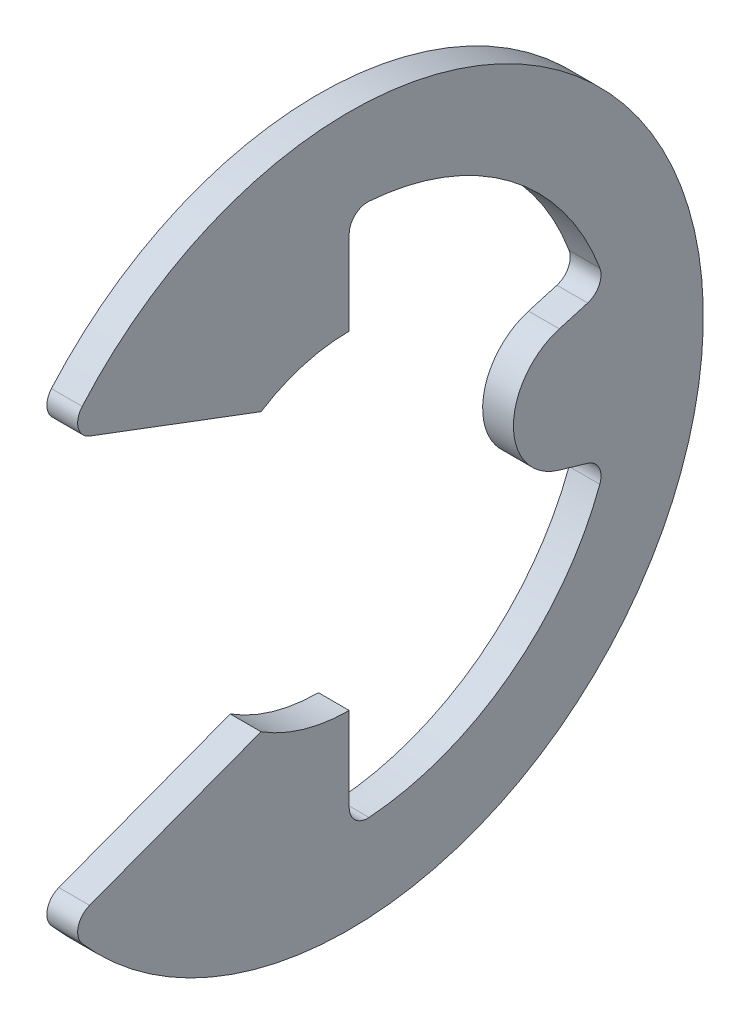
ISO-10303-21;
HEADER;
FILE_DESCRIPTION(('STEP AP214'),'2;1');
FILE_NAME('part.step','',(''),(''),'','','');
FILE_SCHEMA(('AUTOMOTIVE_DESIGN { 1 0 10303 214 1 1 1 1 }'));
ENDSEC;
DATA;
#1=APPLICATION_CONTEXT('core data for automotive mechanical design processes');
#2=APPLICATION_PROTOCOL_DEFINITION('international standard','automotive_design',2000,#1);
#3=PRODUCT_CONTEXT('',#1,'mechanical');
#4=PRODUCT('Part','Part','',(#3));
#5=PRODUCT_RELATED_PRODUCT_CATEGORY('part','',(#4));
#6=PRODUCT_DEFINITION_FORMATION('','',#4);
#7=PRODUCT_DEFINITION_CONTEXT('part definition',#1,'design');
#8=PRODUCT_DEFINITION('design','',#6,#7);
#9=PRODUCT_DEFINITION_SHAPE('','',#8);
#10=(LENGTH_UNIT() NAMED_UNIT(*) SI_UNIT(.MILLI.,.METRE.));
#11=(NAMED_UNIT(*) PLANE_ANGLE_UNIT() SI_UNIT($,.RADIAN.));
#12=(NAMED_UNIT(*) SI_UNIT($,.STERADIAN.) SOLID_ANGLE_UNIT());
#13=UNCERTAINTY_MEASURE_WITH_UNIT(LENGTH_MEASURE(1.E-05),#10,'distance_accuracy_value','');
#14=(GEOMETRIC_REPRESENTATION_CONTEXT(3) GLOBAL_UNCERTAINTY_ASSIGNED_CONTEXT((#13)) GLOBAL_UNIT_ASSIGNED_CONTEXT((#10,
#11,#12)) REPRESENTATION_CONTEXT('',''));
#15=CARTESIAN_POINT('',(0.,0.,0.));
#16=DIRECTION('',(0.,0.,1.));
#17=DIRECTION('',(1.,0.,0.));
#18=AXIS2_PLACEMENT_3D('',#15,#16,#17);
#19=CARTESIAN_POINT('',(0.18,-0.595966918772489,-2.04721359549996));
#20=CARTESIAN_POINT('',(0.17,-0.595966918772489,-2.04721359549996));
#21=CARTESIAN_POINT('',(0.16,-0.595966918772489,-2.04721359549996));
#22=CARTESIAN_POINT('',(0.0500000000000017,-0.595966918772489,-2.04721359549996));
#23=CARTESIAN_POINT('',(-0.0500000000000009,-0.595966918772489,-2.04721359549996));
#24=CARTESIAN_POINT('',(-0.16,-0.595966918772489,-2.04721359549996));
#25=CARTESIAN_POINT('',(-0.17,-0.595966918772489,-2.04721359549996));
#26=CARTESIAN_POINT('',(-0.18,-0.595966918772489,-2.04721359549996));
#27=CARTESIAN_POINT('',(0.18,-0.382270957226755,-1.31314386109097));
#28=CARTESIAN_POINT('',(0.17,-0.382270957226755,-1.31314386109097));
#29=CARTESIAN_POINT('',(0.16,-0.382270957226755,-1.31314386109097));
#30=CARTESIAN_POINT('',(0.0500000000000017,-0.382270957226755,-1.31314386109097));
#31=CARTESIAN_POINT('',(-0.0500000000000009,-0.382270957226755,-1.31314386109097));
#32=CARTESIAN_POINT('',(-0.16,-0.382270957226755,-1.31314386109097));
#33=CARTESIAN_POINT('',(-0.17,-0.382270957226755,-1.31314386109097));
#34=CARTESIAN_POINT('',(-0.18,-0.382270957226755,-1.31314386109097));
#35=CARTESIAN_POINT('',(0.18,0.382270957226755,-1.31314386109097));
#36=CARTESIAN_POINT('',(0.17,0.382270957226755,-1.31314386109097));
#37=CARTESIAN_POINT('',(0.16,0.382270957226755,-1.31314386109097));
#38=CARTESIAN_POINT('',(0.0500000000000017,0.382270957226755,-1.31314386109097));
#39=CARTESIAN_POINT('',(-0.0500000000000009,0.382270957226755,-1.31314386109097));
#40=CARTESIAN_POINT('',(-0.16,0.382270957226755,-1.31314386109097));
#41=CARTESIAN_POINT('',(-0.17,0.382270957226755,-1.31314386109097));
#42=CARTESIAN_POINT('',(-0.18,0.382270957226755,-1.31314386109097));
#43=CARTESIAN_POINT('',(0.18,0.595966918772489,-2.04721359549996));
#44=CARTESIAN_POINT('',(0.17,0.595966918772489,-2.04721359549996));
#45=CARTESIAN_POINT('',(0.16,0.595966918772489,-2.04721359549996));
#46=CARTESIAN_POINT('',(0.0500000000000017,0.595966918772489,-2.04721359549996));
#47=CARTESIAN_POINT('',(-0.0500000000000009,0.595966918772489,-2.04721359549996));
#48=CARTESIAN_POINT('',(-0.16,0.595966918772489,-2.04721359549996));
#49=CARTESIAN_POINT('',(-0.17,0.595966918772489,-2.04721359549996));
#50=CARTESIAN_POINT('',(-0.18,0.595966918772489,-2.04721359549996));
#51=(BOUNDED_SURFACE() B_SPLINE_SURFACE(3,3,((#19,#20,#21,#22,#23,#24,#25,#26),(#27,#28,#29,#30,
#31,#32,#33,#34),(#35,#36,#37,#38,#39,#40,#41,#42),(#43,#44,#45,#46,#47,#48,#49,#50)),
.UNSPECIFIED.,.F.,.F.,.F.) B_SPLINE_SURFACE_WITH_KNOTS((4,4),(4,2,2,4),(0.,1.),(-0.1,0.,1.,1.1),
.UNSPECIFIED.) GEOMETRIC_REPRESENTATION_ITEM() RATIONAL_B_SPLINE_SURFACE(((1.,1.,1.,1.,1.,1.,1.,
1.),(0.519672331458315,0.519672331458315,0.519672331458315,0.519672331458315,0.519672331458315,
0.519672331458315,0.519672331458315,0.519672331458315),(0.519672331458315,0.519672331458315,
0.519672331458315,0.519672331458315,0.519672331458315,0.519672331458315,0.519672331458315,
0.519672331458315),(1.,1.,1.,1.,1.,1.,1.,1.))) REPRESENTATION_ITEM('') SURFACE());
#52=CARTESIAN_POINT('',(0.18,0.595966918772489,-2.04721359549996));
#53=CARTESIAN_POINT('',(0.17,0.595966918772489,-2.04721359549996));
#54=CARTESIAN_POINT('',(0.16,0.595966918772489,-2.04721359549996));
#55=CARTESIAN_POINT('',(0.0500000000000017,0.595966918772489,-2.04721359549996));
#56=CARTESIAN_POINT('',(-0.0500000000000009,0.595966918772489,-2.04721359549996));
#57=CARTESIAN_POINT('',(-0.16,0.595966918772489,-2.04721359549996));
#58=CARTESIAN_POINT('',(-0.17,0.595966918772489,-2.04721359549996));
#59=CARTESIAN_POINT('',(-0.18,0.595966918772489,-2.04721359549996));
#60=(BOUNDED_CURVE() B_SPLINE_CURVE(3,(#52,#53,#54,#55,#56,#57,#58,#59),.UNSPECIFIED.,.F.,
.F.) B_SPLINE_CURVE_WITH_KNOTS((4,2,2,4),(-0.1,0.,1.,1.1),
.UNSPECIFIED.) CURVE() GEOMETRIC_REPRESENTATION_ITEM() RATIONAL_B_SPLINE_CURVE((1.,1.,1.,1.,1.,
1.,1.,1.)) REPRESENTATION_ITEM(''));
#61=CARTESIAN_POINT('',(-0.15,0.595966918772489,-2.04721359549996));
#62=VERTEX_POINT('',#61);
#63=CARTESIAN_POINT('',(0.15,0.595966918772489,-2.04721359549996));
#64=VERTEX_POINT('',#63);
#65=EDGE_CURVE('E334',#62,#64,#60,.F.);
#66=CARTESIAN_POINT('',(-0.15,0.595966918772489,-2.04721359549996));
#67=CARTESIAN_POINT('',(-0.15,0.382270957226755,-1.31314386109097));
#68=CARTESIAN_POINT('',(-0.15,-0.382270957226755,-1.31314386109097));
#69=CARTESIAN_POINT('',(-0.15,-0.595966918772489,-2.04721359549996));
#70=(BOUNDED_CURVE() B_SPLINE_CURVE(3,(#66,#67,#68,#69),.UNSPECIFIED.,.F.,
.F.) B_SPLINE_CURVE_WITH_KNOTS((4,4),(0.,1.),
.UNSPECIFIED.) CURVE() GEOMETRIC_REPRESENTATION_ITEM() RATIONAL_B_SPLINE_CURVE((1.,
0.519672331458315,0.519672331458315,1.)) REPRESENTATION_ITEM(''));
#71=CARTESIAN_POINT('',(-0.15,-0.595966918772489,-2.04721359549996));
#72=VERTEX_POINT('',#71);
#73=EDGE_CURVE('E68',#72,#62,#70,.F.);
#74=CARTESIAN_POINT('',(-0.18,-0.595966918772489,-2.04721359549996));
#75=CARTESIAN_POINT('',(-0.17,-0.595966918772489,-2.04721359549996));
#76=CARTESIAN_POINT('',(-0.16,-0.595966918772489,-2.04721359549996));
#77=CARTESIAN_POINT('',(-0.0500000000000009,-0.595966918772489,-2.04721359549996));
#78=CARTESIAN_POINT('',(0.0500000000000017,-0.595966918772489,-2.04721359549996));
#79=CARTESIAN_POINT('',(0.16,-0.595966918772489,-2.04721359549996));
#80=CARTESIAN_POINT('',(0.17,-0.595966918772489,-2.04721359549996));
#81=CARTESIAN_POINT('',(0.18,-0.595966918772489,-2.04721359549996));
#82=(BOUNDED_CURVE() B_SPLINE_CURVE(3,(#74,#75,#76,#77,#78,#79,#80,#81),.UNSPECIFIED.,.F.,
.F.) B_SPLINE_CURVE_WITH_KNOTS((4,2,2,4),(-0.1,0.,1.,1.1),
.UNSPECIFIED.) CURVE() GEOMETRIC_REPRESENTATION_ITEM() RATIONAL_B_SPLINE_CURVE((1.,1.,1.,1.,1.,
1.,1.,1.)) REPRESENTATION_ITEM(''));
#83=CARTESIAN_POINT('',(0.15,-0.595966918772489,-2.04721359549996));
#84=VERTEX_POINT('',#83);
#85=EDGE_CURVE('E265',#84,#72,#82,.F.);
#86=CARTESIAN_POINT('',(0.15,-0.595966918772489,-2.04721359549996));
#87=CARTESIAN_POINT('',(0.15,-0.382270957226755,-1.31314386109097));
#88=CARTESIAN_POINT('',(0.15,0.382270957226755,-1.31314386109097));
#89=CARTESIAN_POINT('',(0.15,0.595966918772489,-2.04721359549996));
#90=(BOUNDED_CURVE() B_SPLINE_CURVE(3,(#86,#87,#88,#89),.UNSPECIFIED.,.F.,
.F.) B_SPLINE_CURVE_WITH_KNOTS((4,4),(0.,1.),
.UNSPECIFIED.) CURVE() GEOMETRIC_REPRESENTATION_ITEM() RATIONAL_B_SPLINE_CURVE((1.,
0.519672331458315,0.519672331458315,1.)) REPRESENTATION_ITEM(''));
#91=EDGE_CURVE('E12',#64,#84,#90,.F.);
#92=ORIENTED_EDGE('',*,*,#65,.F.);
#93=ORIENTED_EDGE('',*,*,#73,.F.);
#94=ORIENTED_EDGE('',*,*,#85,.F.);
#95=ORIENTED_EDGE('',*,*,#91,.F.);
#96=EDGE_LOOP('',(#92,#93,#94,#95));
#97=FACE_BOUND('',#96,.T.);
#98=ADVANCED_FACE('F54',(#97),#51,.T.);
#99=CARTESIAN_POINT('',(0.15,0.,0.));
#100=DIRECTION('',(-1.,0.,0.));
#101=DIRECTION('',(0.,0.,1.));
#102=AXIS2_PLACEMENT_3D('',#99,#100,#101);
#103=CYLINDRICAL_SURFACE('',#102,3.45);
#104=CARTESIAN_POINT('',(0.15,0.,0.));
#105=DIRECTION('',(1.,0.,0.));
#106=DIRECTION('',(0.,0.,-1.));
#107=AXIS2_PLACEMENT_3D('',#104,#105,#106);
#108=CIRCLE('',#107,3.45);
#109=CARTESIAN_POINT('',(0.15,-2.26626447344389,2.60125841400006));
#110=VERTEX_POINT('',#109);
#111=CARTESIAN_POINT('',(0.15,2.26626447344389,2.60125841400006));
#112=VERTEX_POINT('',#111);
#113=EDGE_CURVE('E196',#110,#112,#108,.T.);
#114=ORIENTED_EDGE('',*,*,#113,.F.);
#115=DIRECTION('',(-1.,0.,0.));
#116=VECTOR('',#115,1.);
#117=CARTESIAN_POINT('',(0.15,-2.26626447344389,2.60125841400006));
#118=LINE('',#117,#116);
#119=CARTESIAN_POINT('',(-0.15,-2.26626447344389,2.60125841400006));
#120=VERTEX_POINT('',#119);
#121=EDGE_CURVE('E430',#110,#120,#118,.T.);
#122=ORIENTED_EDGE('',*,*,#121,.T.);
#123=CARTESIAN_POINT('',(-0.15,0.,0.));
#124=DIRECTION('',(1.,0.,0.));
#125=DIRECTION('',(0.,0.,-1.));
#126=AXIS2_PLACEMENT_3D('',#123,#124,#125);
#127=CIRCLE('',#126,3.45);
#128=CARTESIAN_POINT('',(-0.15,2.26626447344389,2.60125841400006));
#129=VERTEX_POINT('',#128);
#130=EDGE_CURVE('E566',#120,#129,#127,.T.);
#131=ORIENTED_EDGE('',*,*,#130,.T.);
#132=DIRECTION('',(-1.,0.,0.));
#133=VECTOR('',#132,1.);
#134=CARTESIAN_POINT('',(0.15,2.26626447344389,2.60125841400006));
#135=LINE('',#134,#133);
#136=EDGE_CURVE('E436',#129,#112,#135,.F.);
#137=ORIENTED_EDGE('',*,*,#136,.T.);
#138=EDGE_LOOP('',(#114,#122,#131,#137));
#139=FACE_BOUND('',#138,.T.);
#140=ADVANCED_FACE('F300',(#139),#103,.T.);
#141=CARTESIAN_POINT('',(0.15,2.06739271341899,2.76195354206078));
#142=DIRECTION('',(0.,0.935729417671406,-0.352718665375582));
#143=DIRECTION('',(0.,0.352718665375582,0.935729417671406));
#144=AXIS2_PLACEMENT_3D('',#141,#142,#143);
#145=PLANE('',#144);
#146=DIRECTION('',(0.,-0.352718665375582,-0.935729417671406));
#147=VECTOR('',#146,1.);
#148=CARTESIAN_POINT('',(0.15,2.06739271341899,2.76195354206078));
#149=LINE('',#148,#147);
#150=CARTESIAN_POINT('',(0.15,1.97959329269205,2.52902994347201));
#151=VERTEX_POINT('',#150);
#152=CARTESIAN_POINT('',(0.15,1.35,0.858778201865883));
#153=VERTEX_POINT('',#152);
#154=EDGE_CURVE('E182',#151,#153,#149,.T.);
#155=ORIENTED_EDGE('',*,*,#154,.F.);
#156=DIRECTION('',(-1.,0.,0.));
#157=VECTOR('',#156,1.);
#158=CARTESIAN_POINT('',(0.15,1.97959329269205,2.52902994347201));
#159=LINE('',#158,#157);
#160=CARTESIAN_POINT('',(-0.15,1.97959329269205,2.52902994347201));
#161=VERTEX_POINT('',#160);
#162=EDGE_CURVE('E401',#151,#161,#159,.T.);
#163=ORIENTED_EDGE('',*,*,#162,.T.);
#164=DIRECTION('',(0.,-0.352718665375582,-0.935729417671406));
#165=VECTOR('',#164,1.);
#166=CARTESIAN_POINT('',(-0.15,2.06739271341899,2.76195354206078));
#167=LINE('',#166,#165);
#168=CARTESIAN_POINT('',(-0.15,1.35,0.858778201865883));
#169=VERTEX_POINT('',#168);
#170=EDGE_CURVE('E202',#161,#169,#167,.T.);
#171=ORIENTED_EDGE('',*,*,#170,.T.);
#172=DIRECTION('',(-1.,0.,0.));
#173=VECTOR('',#172,1.);
#174=CARTESIAN_POINT('',(0.15,1.35,0.858778201865883));
#175=LINE('',#174,#173);
#176=EDGE_CURVE('E199',#153,#169,#175,.T.);
#177=ORIENTED_EDGE('',*,*,#176,.F.);
#178=EDGE_LOOP('',(#155,#163,#171,#177));
#179=FACE_BOUND('',#178,.T.);
#180=ADVANCED_FACE('F200',(#179),#145,.F.);
#181=CARTESIAN_POINT('',(0.15,0.,0.));
#182=DIRECTION('',(-1.,0.,0.));
#183=DIRECTION('',(0.,0.,1.));
#184=AXIS2_PLACEMENT_3D('',#181,#182,#183);
#185=CYLINDRICAL_SURFACE('',#184,1.6);
#186=CARTESIAN_POINT('',(-0.15,0.,0.));
#187=DIRECTION('',(-1.,0.,0.));
#188=DIRECTION('',(0.,0.,1.));
#189=AXIS2_PLACEMENT_3D('',#186,#187,#188);
#190=CIRCLE('',#189,1.6);
#191=CARTESIAN_POINT('',(-0.15,1.6,0.));
#192=VERTEX_POINT('',#191);
#193=EDGE_CURVE('E558',#169,#192,#190,.T.);
#194=ORIENTED_EDGE('',*,*,#193,.T.);
#195=DIRECTION('',(-1.,0.,0.));
#196=VECTOR('',#195,1.);
#197=CARTESIAN_POINT('',(0.15,1.6,0.));
#198=LINE('',#197,#196);
#199=CARTESIAN_POINT('',(0.15,1.6,0.));
#200=VERTEX_POINT('',#199);
#201=EDGE_CURVE('E207',#200,#192,#198,.T.);
#202=ORIENTED_EDGE('',*,*,#201,.F.);
#203=CARTESIAN_POINT('',(0.15,0.,0.));
#204=DIRECTION('',(-1.,0.,0.));
#205=DIRECTION('',(0.,0.,1.));
#206=AXIS2_PLACEMENT_3D('',#203,#204,#205);
#207=CIRCLE('',#206,1.6);
#208=EDGE_CURVE('E187',#153,#200,#207,.T.);
#209=ORIENTED_EDGE('',*,*,#208,.F.);
#210=ORIENTED_EDGE('',*,*,#176,.T.);
#211=EDGE_LOOP('',(#194,#202,#209,#210));
#212=FACE_BOUND('',#211,.T.);
#213=ADVANCED_FACE('F209',(#212),#185,.F.);
#214=CARTESIAN_POINT('',(0.15,1.6,0.));
#215=DIRECTION('',(0.,0.,1.));
#216=DIRECTION('',(0.,-1.,0.));
#217=AXIS2_PLACEMENT_3D('',#214,#215,#216);
#218=PLANE('',#217);
#219=DIRECTION('',(0.,1.,0.));
#220=VECTOR('',#219,1.);
#221=CARTESIAN_POINT('',(-0.15,1.6,0.));
#222=LINE('',#221,#220);
#223=CARTESIAN_POINT('',(-0.15,2.41976598656991,0.));
#224=VERTEX_POINT('',#223);
#225=EDGE_CURVE('E553',#192,#224,#222,.T.);
#226=ORIENTED_EDGE('',*,*,#225,.T.);
#227=DIRECTION('',(1.,0.,0.));
#228=VECTOR('',#227,1.);
#229=CARTESIAN_POINT('',(0.15,2.41976598656991,0.));
#230=LINE('',#229,#228);
#231=CARTESIAN_POINT('',(0.15,2.41976598656991,0.));
#232=VERTEX_POINT('',#231);
#233=EDGE_CURVE('E441',#224,#232,#230,.T.);
#234=ORIENTED_EDGE('',*,*,#233,.T.);
#235=DIRECTION('',(0.,1.,0.));
#236=VECTOR('',#235,1.);
#237=CARTESIAN_POINT('',(0.15,1.6,0.));
#238=LINE('',#237,#236);
#239=EDGE_CURVE('E213',#200,#232,#238,.T.);
#240=ORIENTED_EDGE('',*,*,#239,.F.);
#241=ORIENTED_EDGE('',*,*,#201,.T.);
#242=EDGE_LOOP('',(#226,#234,#240,#241));
#243=FACE_BOUND('',#242,.T.);
#244=ADVANCED_FACE('F291',(#243),#218,.F.);
#245=CARTESIAN_POINT('',(0.15,0.,0.));
#246=DIRECTION('',(-1.,0.,0.));
#247=DIRECTION('',(0.,0.,1.));
#248=AXIS2_PLACEMENT_3D('',#245,#246,#247);
#249=CYLINDRICAL_SURFACE('',#248,2.60645161290323);
#250=CARTESIAN_POINT('',(0.15,0.,0.));
#251=DIRECTION('',(-1.,0.,0.));
#252=DIRECTION('',(0.,0.,-1.));
#253=AXIS2_PLACEMENT_3D('',#250,#251,#252);
#254=CIRCLE('',#253,2.60645161290323);
#255=CARTESIAN_POINT('',(0.15,2.59927003077438,-0.193352831693698));
#256=VERTEX_POINT('',#255);
#257=CARTESIAN_POINT('',(0.15,0.912164470211487,-2.44162773364197));
#258=VERTEX_POINT('',#257);
#259=EDGE_CURVE('E217',#256,#258,#254,.T.);
#260=ORIENTED_EDGE('',*,*,#259,.F.);
#261=DIRECTION('',(-1.,0.,0.));
#262=VECTOR('',#261,1.);
#263=CARTESIAN_POINT('',(0.15,2.59927003077438,-0.193352831693698));
#264=LINE('',#263,#262);
#265=CARTESIAN_POINT('',(-0.15,2.59927003077438,-0.193352831693698));
#266=VERTEX_POINT('',#265);
#267=EDGE_CURVE('E446',#256,#266,#264,.T.);
#268=ORIENTED_EDGE('',*,*,#267,.T.);
#269=CARTESIAN_POINT('',(-0.15,0.,0.));
#270=DIRECTION('',(-1.,0.,0.));
#271=DIRECTION('',(0.,0.,-1.));
#272=AXIS2_PLACEMENT_3D('',#269,#270,#271);
#273=CIRCLE('',#272,2.60645161290323);
#274=CARTESIAN_POINT('',(-0.15,0.912164470211487,-2.44162773364197));
#275=VERTEX_POINT('',#274);
#276=EDGE_CURVE('E242',#266,#275,#273,.T.);
#277=ORIENTED_EDGE('',*,*,#276,.T.);
#278=DIRECTION('',(-1.,0.,0.));
#279=VECTOR('',#278,1.);
#280=CARTESIAN_POINT('',(0.15,0.912164470211487,-2.44162773364197));
#281=LINE('',#280,#279);
#282=EDGE_CURVE('E452',#275,#258,#281,.F.);
#283=ORIENTED_EDGE('',*,*,#282,.T.);
#284=EDGE_LOOP('',(#260,#268,#277,#283));
#285=FACE_BOUND('',#284,.T.);
#286=ADVANCED_FACE('F287',(#285),#249,.F.);
#287=CARTESIAN_POINT('',(0.15,0.447213595499958,-1.53622914957372));
#288=DIRECTION('',(0.,-0.960143218483576,-0.279508497187474));
#289=DIRECTION('',(0.,0.279508497187474,-0.960143218483576));
#290=AXIS2_PLACEMENT_3D('',#287,#288,#289);
#291=PLANE('',#290);
#292=DIRECTION('',(0.,-0.279508497187474,0.960143218483576));
#293=VECTOR('',#292,1.);
#294=CARTESIAN_POINT('',(-0.15,0.447213595499958,-1.53622914957372));
#295=LINE('',#294,#293);
#296=CARTESIAN_POINT('',(-0.15,0.676345154451521,-2.32332190232232));
#297=VERTEX_POINT('',#296);
#298=EDGE_CURVE('E236',#297,#62,#295,.T.);
#299=ORIENTED_EDGE('',*,*,#298,.T.);
#300=ORIENTED_EDGE('',*,*,#65,.T.);
#301=DIRECTION('',(0.,-0.279508497187474,0.960143218483576));
#302=VECTOR('',#301,1.);
#303=CARTESIAN_POINT('',(0.15,0.447213595499958,-1.53622914957372));
#304=LINE('',#303,#302);
#305=CARTESIAN_POINT('',(0.15,0.676345154451521,-2.32332190232232));
#306=VERTEX_POINT('',#305);
#307=EDGE_CURVE('E224',#306,#64,#304,.T.);
#308=ORIENTED_EDGE('',*,*,#307,.F.);
#309=DIRECTION('',(1.,0.,0.));
#310=VECTOR('',#309,1.);
#311=CARTESIAN_POINT('',(-0.15,0.676345154451521,-2.32332190232232));
#312=LINE('',#311,#310);
#313=EDGE_CURVE('E343',#306,#297,#312,.F.);
#314=ORIENTED_EDGE('',*,*,#313,.T.);
#315=EDGE_LOOP('',(#299,#300,#308,#314));
#316=FACE_BOUND('',#315,.T.);
#317=ADVANCED_FACE('F282',(#316),#291,.F.);
#318=CARTESIAN_POINT('',(0.15,-0.447213595499958,-1.53622914957372));
#319=DIRECTION('',(0.,0.960143218483576,-0.279508497187473));
#320=DIRECTION('',(0.,0.279508497187473,0.960143218483576));
#321=AXIS2_PLACEMENT_3D('',#318,#319,#320);
#322=PLANE('',#321);
#323=DIRECTION('',(0.,-0.279508497187473,-0.960143218483576));
#324=VECTOR('',#323,1.);
#325=CARTESIAN_POINT('',(0.15,-0.447213595499958,-1.53622914957372));
#326=LINE('',#325,#324);
#327=CARTESIAN_POINT('',(0.15,-0.676345154451521,-2.32332190232232));
#328=VERTEX_POINT('',#327);
#329=EDGE_CURVE('E233',#84,#328,#326,.T.);
#330=ORIENTED_EDGE('',*,*,#329,.F.);
#331=ORIENTED_EDGE('',*,*,#85,.T.);
#332=DIRECTION('',(0.,-0.279508497187473,-0.960143218483576));
#333=VECTOR('',#332,1.);
#334=CARTESIAN_POINT('',(-0.15,-0.447213595499958,-1.53622914957372));
#335=LINE('',#334,#333);
#336=CARTESIAN_POINT('',(-0.15,-0.676345154451521,-2.32332190232232));
#337=VERTEX_POINT('',#336);
#338=EDGE_CURVE('E241',#72,#337,#335,.T.);
#339=ORIENTED_EDGE('',*,*,#338,.T.);
#340=DIRECTION('',(1.,0.,0.));
#341=VECTOR('',#340,1.);
#342=CARTESIAN_POINT('',(0.15,-0.676345154451521,-2.32332190232232));
#343=LINE('',#342,#341);
#344=EDGE_CURVE('E395',#337,#328,#343,.T.);
#345=ORIENTED_EDGE('',*,*,#344,.T.);
#346=EDGE_LOOP('',(#330,#331,#339,#345));
#347=FACE_BOUND('',#346,.T.);
#348=ADVANCED_FACE('F272',(#347),#322,.F.);
#349=CARTESIAN_POINT('',(0.15,0.,0.));
#350=DIRECTION('',(-1.,0.,0.));
#351=DIRECTION('',(0.,0.,1.));
#352=AXIS2_PLACEMENT_3D('',#349,#350,#351);
#353=CYLINDRICAL_SURFACE('',#352,2.60645161290323);
#354=CARTESIAN_POINT('',(-0.15,0.,0.));
#355=DIRECTION('',(-1.,0.,0.));
#356=DIRECTION('',(0.,0.,-1.));
#357=AXIS2_PLACEMENT_3D('',#354,#355,#356);
#358=CIRCLE('',#357,2.60645161290323);
#359=CARTESIAN_POINT('',(-0.15,-0.912164470211486,-2.44162773364197));
#360=VERTEX_POINT('',#359);
#361=CARTESIAN_POINT('',(-0.15,-2.59927003077438,-0.193352831693698));
#362=VERTEX_POINT('',#361);
#363=EDGE_CURVE('E251',#360,#362,#358,.T.);
#364=ORIENTED_EDGE('',*,*,#363,.T.);
#365=DIRECTION('',(-1.,0.,0.));
#366=VECTOR('',#365,1.);
#367=CARTESIAN_POINT('',(0.15,-2.59927003077438,-0.193352831693698));
#368=LINE('',#367,#366);
#369=CARTESIAN_POINT('',(0.15,-2.59927003077438,-0.193352831693698));
#370=VERTEX_POINT('',#369);
#371=EDGE_CURVE('E457',#362,#370,#368,.F.);
#372=ORIENTED_EDGE('',*,*,#371,.T.);
#373=CARTESIAN_POINT('',(0.15,0.,0.));
#374=DIRECTION('',(-1.,0.,0.));
#375=DIRECTION('',(0.,0.,-1.));
#376=AXIS2_PLACEMENT_3D('',#373,#374,#375);
#377=CIRCLE('',#376,2.60645161290323);
#378=CARTESIAN_POINT('',(0.15,-0.912164470211486,-2.44162773364197));
#379=VERTEX_POINT('',#378);
#380=EDGE_CURVE('E261',#379,#370,#377,.T.);
#381=ORIENTED_EDGE('',*,*,#380,.F.);
#382=DIRECTION('',(-1.,0.,0.));
#383=VECTOR('',#382,1.);
#384=CARTESIAN_POINT('',(0.15,-0.912164470211486,-2.44162773364197));
#385=LINE('',#384,#383);
#386=EDGE_CURVE('E462',#379,#360,#385,.T.);
#387=ORIENTED_EDGE('',*,*,#386,.T.);
#388=EDGE_LOOP('',(#364,#372,#381,#387));
#389=FACE_BOUND('',#388,.T.);
#390=ADVANCED_FACE('F281',(#389),#353,.F.);
#391=CARTESIAN_POINT('',(0.15,-1.6,0.));
#392=DIRECTION('',(0.,0.,1.));
#393=DIRECTION('',(0.,-1.,0.));
#394=AXIS2_PLACEMENT_3D('',#391,#392,#393);
#395=PLANE('',#394);
#396=DIRECTION('',(0.,1.,0.));
#397=VECTOR('',#396,1.);
#398=CARTESIAN_POINT('',(0.15,-1.6,0.));
#399=LINE('',#398,#397);
#400=CARTESIAN_POINT('',(0.15,-2.41976598656991,0.));
#401=VERTEX_POINT('',#400);
#402=CARTESIAN_POINT('',(0.15,-1.6,0.));
#403=VERTEX_POINT('',#402);
#404=EDGE_CURVE('E502',#401,#403,#399,.T.);
#405=ORIENTED_EDGE('',*,*,#404,.F.);
#406=DIRECTION('',(1.,0.,0.));
#407=VECTOR('',#406,1.);
#408=CARTESIAN_POINT('',(-0.15,-2.41976598656991,0.));
#409=LINE('',#408,#407);
#410=CARTESIAN_POINT('',(-0.15,-2.41976598656991,0.));
#411=VERTEX_POINT('',#410);
#412=EDGE_CURVE('E206',#401,#411,#409,.F.);
#413=ORIENTED_EDGE('',*,*,#412,.T.);
#414=DIRECTION('',(0.,1.,0.));
#415=VECTOR('',#414,1.);
#416=CARTESIAN_POINT('',(-0.15,-1.6,0.));
#417=LINE('',#416,#415);
#418=CARTESIAN_POINT('',(-0.15,-1.6,0.));
#419=VERTEX_POINT('',#418);
#420=EDGE_CURVE('E537',#411,#419,#417,.T.);
#421=ORIENTED_EDGE('',*,*,#420,.T.);
#422=DIRECTION('',(-1.,0.,0.));
#423=VECTOR('',#422,1.);
#424=CARTESIAN_POINT('',(0.15,-1.6,0.));
#425=LINE('',#424,#423);
#426=EDGE_CURVE('E479',#403,#419,#425,.T.);
#427=ORIENTED_EDGE('',*,*,#426,.F.);
#428=EDGE_LOOP('',(#405,#413,#421,#427));
#429=FACE_BOUND('',#428,.T.);
#430=ADVANCED_FACE('F598',(#429),#395,.F.);
#431=CARTESIAN_POINT('',(0.15,0.,0.));
#432=DIRECTION('',(-1.,0.,0.));
#433=DIRECTION('',(0.,0.,1.));
#434=AXIS2_PLACEMENT_3D('',#431,#432,#433);
#435=CYLINDRICAL_SURFACE('',#434,1.6);
#436=CARTESIAN_POINT('',(-0.15,0.,0.));
#437=DIRECTION('',(-1.,0.,0.));
#438=DIRECTION('',(0.,0.,-1.));
#439=AXIS2_PLACEMENT_3D('',#436,#437,#438);
#440=CIRCLE('',#439,1.6);
#441=CARTESIAN_POINT('',(-0.15,-1.35,0.858778201865883));
#442=VERTEX_POINT('',#441);
#443=EDGE_CURVE('E532',#419,#442,#440,.T.);
#444=ORIENTED_EDGE('',*,*,#443,.T.);
#445=DIRECTION('',(-1.,0.,0.));
#446=VECTOR('',#445,1.);
#447=CARTESIAN_POINT('',(0.15,-1.35,0.858778201865883));
#448=LINE('',#447,#446);
#449=CARTESIAN_POINT('',(0.15,-1.35,0.858778201865883));
#450=VERTEX_POINT('',#449);
#451=EDGE_CURVE('E485',#450,#442,#448,.T.);
#452=ORIENTED_EDGE('',*,*,#451,.F.);
#453=CARTESIAN_POINT('',(0.15,0.,0.));
#454=DIRECTION('',(-1.,0.,0.));
#455=DIRECTION('',(0.,0.,-1.));
#456=AXIS2_PLACEMENT_3D('',#453,#454,#455);
#457=CIRCLE('',#456,1.6);
#458=EDGE_CURVE('E497',#403,#450,#457,.T.);
#459=ORIENTED_EDGE('',*,*,#458,.F.);
#460=ORIENTED_EDGE('',*,*,#426,.T.);
#461=EDGE_LOOP('',(#444,#452,#459,#460));
#462=FACE_BOUND('',#461,.T.);
#463=ADVANCED_FACE('F594',(#462),#435,.F.);
#464=CARTESIAN_POINT('',(0.15,-2.06739271341899,2.76195354206077));
#465=DIRECTION('',(0.,-0.935729417671406,-0.352718665375583));
#466=DIRECTION('',(0.,0.352718665375583,-0.935729417671406));
#467=AXIS2_PLACEMENT_3D('',#464,#465,#466);
#468=PLANE('',#467);
#469=DIRECTION('',(0.,-0.352718665375583,0.935729417671406));
#470=VECTOR('',#469,1.);
#471=CARTESIAN_POINT('',(-0.15,-2.06739271341899,2.76195354206077));
#472=LINE('',#471,#470);
#473=CARTESIAN_POINT('',(-0.15,-1.97959329269205,2.52902994347201));
#474=VERTEX_POINT('',#473);
#475=EDGE_CURVE('E527',#442,#474,#472,.T.);
#476=ORIENTED_EDGE('',*,*,#475,.T.);
#477=DIRECTION('',(-1.,0.,0.));
#478=VECTOR('',#477,1.);
#479=CARTESIAN_POINT('',(0.15,-1.97959329269205,2.52902994347201));
#480=LINE('',#479,#478);
#481=CARTESIAN_POINT('',(0.15,-1.97959329269205,2.52902994347201));
#482=VERTEX_POINT('',#481);
#483=EDGE_CURVE('E415',#474,#482,#480,.F.);
#484=ORIENTED_EDGE('',*,*,#483,.T.);
#485=DIRECTION('',(0.,-0.352718665375583,0.935729417671406));
#486=VECTOR('',#485,1.);
#487=CARTESIAN_POINT('',(0.15,-2.06739271341899,2.76195354206077));
#488=LINE('',#487,#486);
#489=EDGE_CURVE('E491',#450,#482,#488,.T.);
#490=ORIENTED_EDGE('',*,*,#489,.F.);
#491=ORIENTED_EDGE('',*,*,#451,.T.);
#492=EDGE_LOOP('',(#476,#484,#490,#491));
#493=FACE_BOUND('',#492,.T.);
#494=ADVANCED_FACE('F586',(#493),#468,.F.);
#495=CARTESIAN_POINT('',(0.15,0.,0.));
#496=DIRECTION('',(1.,0.,0.));
#497=DIRECTION('',(0.,0.,-1.));
#498=AXIS2_PLACEMENT_3D('',#495,#496,#497);
#499=PLANE('',#498);
#500=ORIENTED_EDGE('',*,*,#307,.T.);
#501=ORIENTED_EDGE('',*,*,#91,.T.);
#502=ORIENTED_EDGE('',*,*,#329,.T.);
#503=CARTESIAN_POINT('',(0.15,-0.849170933778564,-2.27301037282858));
#504=DIRECTION('',(1.,0.,0.));
#505=DIRECTION('',(0.,0.,-1.));
#506=AXIS2_PLACEMENT_3D('',#503,#504,#505);
#507=CIRCLE('',#506,0.18);
#508=EDGE_CURVE('E362',#328,#379,#507,.F.);
#509=ORIENTED_EDGE('',*,*,#508,.T.);
#510=ORIENTED_EDGE('',*,*,#380,.T.);
#511=CARTESIAN_POINT('',(0.15,-2.41976598656991,-0.18));
#512=DIRECTION('',(1.,0.,0.));
#513=DIRECTION('',(0.,0.,-1.));
#514=AXIS2_PLACEMENT_3D('',#511,#512,#513);
#515=CIRCLE('',#514,0.18);
#516=EDGE_CURVE('E381',#370,#401,#515,.F.);
#517=ORIENTED_EDGE('',*,*,#516,.T.);
#518=ORIENTED_EDGE('',*,*,#404,.T.);
#519=ORIENTED_EDGE('',*,*,#458,.T.);
#520=ORIENTED_EDGE('',*,*,#489,.T.);
#521=CARTESIAN_POINT('',(0.15,-2.1480245878729,2.4655405837044));
#522=DIRECTION('',(1.,0.,0.));
#523=DIRECTION('',(0.,0.,-1.));
#524=AXIS2_PLACEMENT_3D('',#521,#522,#523);
#525=CIRCLE('',#524,0.18);
#526=EDGE_CURVE('E406',#482,#110,#525,.T.);
#527=ORIENTED_EDGE('',*,*,#526,.T.);
#528=ORIENTED_EDGE('',*,*,#113,.T.);
#529=CARTESIAN_POINT('',(0.15,2.1480245878729,2.4655405837044));
#530=DIRECTION('',(1.,0.,0.));
#531=DIRECTION('',(0.,0.,-1.));
#532=AXIS2_PLACEMENT_3D('',#529,#530,#531);
#533=CIRCLE('',#532,0.18);
#534=EDGE_CURVE('E191',#112,#151,#533,.T.);
#535=ORIENTED_EDGE('',*,*,#534,.T.);
#536=ORIENTED_EDGE('',*,*,#154,.T.);
#537=ORIENTED_EDGE('',*,*,#208,.T.);
#538=ORIENTED_EDGE('',*,*,#239,.T.);
#539=CARTESIAN_POINT('',(0.15,2.41976598656991,-0.179999999999999));
#540=DIRECTION('',(1.,0.,0.));
#541=DIRECTION('',(0.,0.,-1.));
#542=AXIS2_PLACEMENT_3D('',#539,#540,#541);
#543=CIRCLE('',#542,0.18);
#544=EDGE_CURVE('E371',#232,#256,#543,.F.);
#545=ORIENTED_EDGE('',*,*,#544,.T.);
#546=ORIENTED_EDGE('',*,*,#259,.T.);
#547=CARTESIAN_POINT('',(0.15,0.849170933778565,-2.27301037282858));
#548=DIRECTION('',(1.,0.,0.));
#549=DIRECTION('',(0.,0.,-1.));
#550=AXIS2_PLACEMENT_3D('',#547,#548,#549);
#551=CIRCLE('',#550,0.18);
#552=EDGE_CURVE('E234',#258,#306,#551,.F.);
#553=ORIENTED_EDGE('',*,*,#552,.T.);
#554=EDGE_LOOP('',(#500,#501,#502,#509,#510,#517,#518,#519,#520,#527,#528,#535,#536,#537,#538,
#545,#546,#553));
#555=FACE_BOUND('',#554,.T.);
#556=ADVANCED_FACE('F184',(#555),#499,.T.);
#557=CARTESIAN_POINT('',(-0.15,0.,0.));
#558=DIRECTION('',(1.,0.,0.));
#559=DIRECTION('',(0.,0.,-1.));
#560=AXIS2_PLACEMENT_3D('',#557,#558,#559);
#561=PLANE('',#560);
#562=ORIENTED_EDGE('',*,*,#338,.F.);
#563=ORIENTED_EDGE('',*,*,#73,.T.);
#564=ORIENTED_EDGE('',*,*,#298,.F.);
#565=CARTESIAN_POINT('',(-0.15,0.849170933778565,-2.27301037282858));
#566=DIRECTION('',(1.,0.,0.));
#567=DIRECTION('',(0.,0.,-1.));
#568=AXIS2_PLACEMENT_3D('',#565,#566,#567);
#569=CIRCLE('',#568,0.18);
#570=EDGE_CURVE('E346',#297,#275,#569,.T.);
#571=ORIENTED_EDGE('',*,*,#570,.T.);
#572=ORIENTED_EDGE('',*,*,#276,.F.);
#573=CARTESIAN_POINT('',(-0.15,2.41976598656991,-0.179999999999999));
#574=DIRECTION('',(1.,0.,0.));
#575=DIRECTION('',(0.,0.,-1.));
#576=AXIS2_PLACEMENT_3D('',#573,#574,#575);
#577=CIRCLE('',#576,0.18);
#578=EDGE_CURVE('E376',#266,#224,#577,.T.);
#579=ORIENTED_EDGE('',*,*,#578,.T.);
#580=ORIENTED_EDGE('',*,*,#225,.F.);
#581=ORIENTED_EDGE('',*,*,#193,.F.);
#582=ORIENTED_EDGE('',*,*,#170,.F.);
#583=CARTESIAN_POINT('',(-0.15,2.1480245878729,2.4655405837044));
#584=DIRECTION('',(1.,0.,0.));
#585=DIRECTION('',(0.,0.,-1.));
#586=AXIS2_PLACEMENT_3D('',#583,#584,#585);
#587=CIRCLE('',#586,0.18);
#588=EDGE_CURVE('E425',#161,#129,#587,.F.);
#589=ORIENTED_EDGE('',*,*,#588,.T.);
#590=ORIENTED_EDGE('',*,*,#130,.F.);
#591=CARTESIAN_POINT('',(-0.15,-2.1480245878729,2.4655405837044));
#592=DIRECTION('',(1.,0.,0.));
#593=DIRECTION('',(0.,0.,-1.));
#594=AXIS2_PLACEMENT_3D('',#591,#592,#593);
#595=CIRCLE('',#594,0.18);
#596=EDGE_CURVE('E420',#120,#474,#595,.F.);
#597=ORIENTED_EDGE('',*,*,#596,.T.);
#598=ORIENTED_EDGE('',*,*,#475,.F.);
#599=ORIENTED_EDGE('',*,*,#443,.F.);
#600=ORIENTED_EDGE('',*,*,#420,.F.);
#601=CARTESIAN_POINT('',(-0.15,-2.41976598656991,-0.18));
#602=DIRECTION('',(1.,0.,0.));
#603=DIRECTION('',(0.,0.,-1.));
#604=AXIS2_PLACEMENT_3D('',#601,#602,#603);
#605=CIRCLE('',#604,0.18);
#606=EDGE_CURVE('E386',#411,#362,#605,.T.);
#607=ORIENTED_EDGE('',*,*,#606,.T.);
#608=ORIENTED_EDGE('',*,*,#363,.F.);
#609=CARTESIAN_POINT('',(-0.15,-0.849170933778564,-2.27301037282858));
#610=DIRECTION('',(1.,0.,0.));
#611=DIRECTION('',(0.,0.,-1.));
#612=AXIS2_PLACEMENT_3D('',#609,#610,#611);
#613=CIRCLE('',#612,0.18);
#614=EDGE_CURVE('E366',#360,#337,#613,.T.);
#615=ORIENTED_EDGE('',*,*,#614,.T.);
#616=EDGE_LOOP('',(#562,#563,#564,#571,#572,#579,#580,#581,#582,#589,#590,#597,#598,#599,#600,
#607,#608,#615));
#617=FACE_BOUND('',#616,.T.);
#618=ADVANCED_FACE('F308',(#617),#561,.F.);
#619=CARTESIAN_POINT('',(0.15,-2.41976598656991,-0.18));
#620=DIRECTION('',(-1.,0.,0.));
#621=DIRECTION('',(0.,0.,1.));
#622=AXIS2_PLACEMENT_3D('',#619,#620,#621);
#623=CYLINDRICAL_SURFACE('',#622,0.18);
#624=ORIENTED_EDGE('',*,*,#516,.F.);
#625=ORIENTED_EDGE('',*,*,#371,.F.);
#626=ORIENTED_EDGE('',*,*,#606,.F.);
#627=ORIENTED_EDGE('',*,*,#412,.F.);
#628=EDGE_LOOP('',(#624,#625,#626,#627));
#629=FACE_BOUND('',#628,.T.);
#630=ADVANCED_FACE('F304',(#629),#623,.F.);
#631=CARTESIAN_POINT('',(0.15,2.41976598656991,-0.179999999999999));
#632=DIRECTION('',(-1.,0.,0.));
#633=DIRECTION('',(0.,0.,1.));
#634=AXIS2_PLACEMENT_3D('',#631,#632,#633);
#635=CYLINDRICAL_SURFACE('',#634,0.18);
#636=ORIENTED_EDGE('',*,*,#544,.F.);
#637=ORIENTED_EDGE('',*,*,#233,.F.);
#638=ORIENTED_EDGE('',*,*,#578,.F.);
#639=ORIENTED_EDGE('',*,*,#267,.F.);
#640=EDGE_LOOP('',(#636,#637,#638,#639));
#641=FACE_BOUND('',#640,.T.);
#642=ADVANCED_FACE('F307',(#641),#635,.F.);
#643=CARTESIAN_POINT('',(0.15,-2.1480245878729,2.4655405837044));
#644=DIRECTION('',(-1.,0.,0.));
#645=DIRECTION('',(0.,0.,1.));
#646=AXIS2_PLACEMENT_3D('',#643,#644,#645);
#647=CYLINDRICAL_SURFACE('',#646,0.18);
#648=ORIENTED_EDGE('',*,*,#526,.F.);
#649=ORIENTED_EDGE('',*,*,#483,.F.);
#650=ORIENTED_EDGE('',*,*,#596,.F.);
#651=ORIENTED_EDGE('',*,*,#121,.F.);
#652=EDGE_LOOP('',(#648,#649,#650,#651));
#653=FACE_BOUND('',#652,.T.);
#654=ADVANCED_FACE('F312',(#653),#647,.T.);
#655=CARTESIAN_POINT('',(0.15,2.1480245878729,2.4655405837044));
#656=DIRECTION('',(-1.,0.,0.));
#657=DIRECTION('',(0.,0.,1.));
#658=AXIS2_PLACEMENT_3D('',#655,#656,#657);
#659=CYLINDRICAL_SURFACE('',#658,0.18);
#660=ORIENTED_EDGE('',*,*,#534,.F.);
#661=ORIENTED_EDGE('',*,*,#136,.F.);
#662=ORIENTED_EDGE('',*,*,#588,.F.);
#663=ORIENTED_EDGE('',*,*,#162,.F.);
#664=EDGE_LOOP('',(#660,#661,#662,#663));
#665=FACE_BOUND('',#664,.T.);
#666=ADVANCED_FACE('F316',(#665),#659,.T.);
#667=CARTESIAN_POINT('',(0.15,-0.849170933778564,-2.27301037282858));
#668=DIRECTION('',(-1.,0.,0.));
#669=DIRECTION('',(0.,0.,1.));
#670=AXIS2_PLACEMENT_3D('',#667,#668,#669);
#671=CYLINDRICAL_SURFACE('',#670,0.18);
#672=ORIENTED_EDGE('',*,*,#508,.F.);
#673=ORIENTED_EDGE('',*,*,#344,.F.);
#674=ORIENTED_EDGE('',*,*,#614,.F.);
#675=ORIENTED_EDGE('',*,*,#386,.F.);
#676=EDGE_LOOP('',(#672,#673,#674,#675));
#677=FACE_BOUND('',#676,.T.);
#678=ADVANCED_FACE('F320',(#677),#671,.F.);
#679=CARTESIAN_POINT('',(0.15,0.849170933778565,-2.27301037282858));
#680=DIRECTION('',(-1.,0.,0.));
#681=DIRECTION('',(0.,0.,1.));
#682=AXIS2_PLACEMENT_3D('',#679,#680,#681);
#683=CYLINDRICAL_SURFACE('',#682,0.18);
#684=ORIENTED_EDGE('',*,*,#552,.F.);
#685=ORIENTED_EDGE('',*,*,#282,.F.);
#686=ORIENTED_EDGE('',*,*,#570,.F.);
#687=ORIENTED_EDGE('',*,*,#313,.F.);
#688=EDGE_LOOP('',(#684,#685,#686,#687));
#689=FACE_BOUND('',#688,.T.);
#690=ADVANCED_FACE('F323',(#689),#683,.F.);
#691=CLOSED_SHELL('',(#98,#140,#180,#213,#244,#286,#317,#348,#390,#430,#463,#494,#556,#618,#630,
#642,#654,#666,#678,#690));
#692=MANIFOLD_SOLID_BREP('B2',#691);
#693=ADVANCED_BREP_SHAPE_REPRESENTATION('',(#18,#692),#14);
#694=SHAPE_DEFINITION_REPRESENTATION(#9,#693);
ENDSEC;
END-ISO-10303-21;
